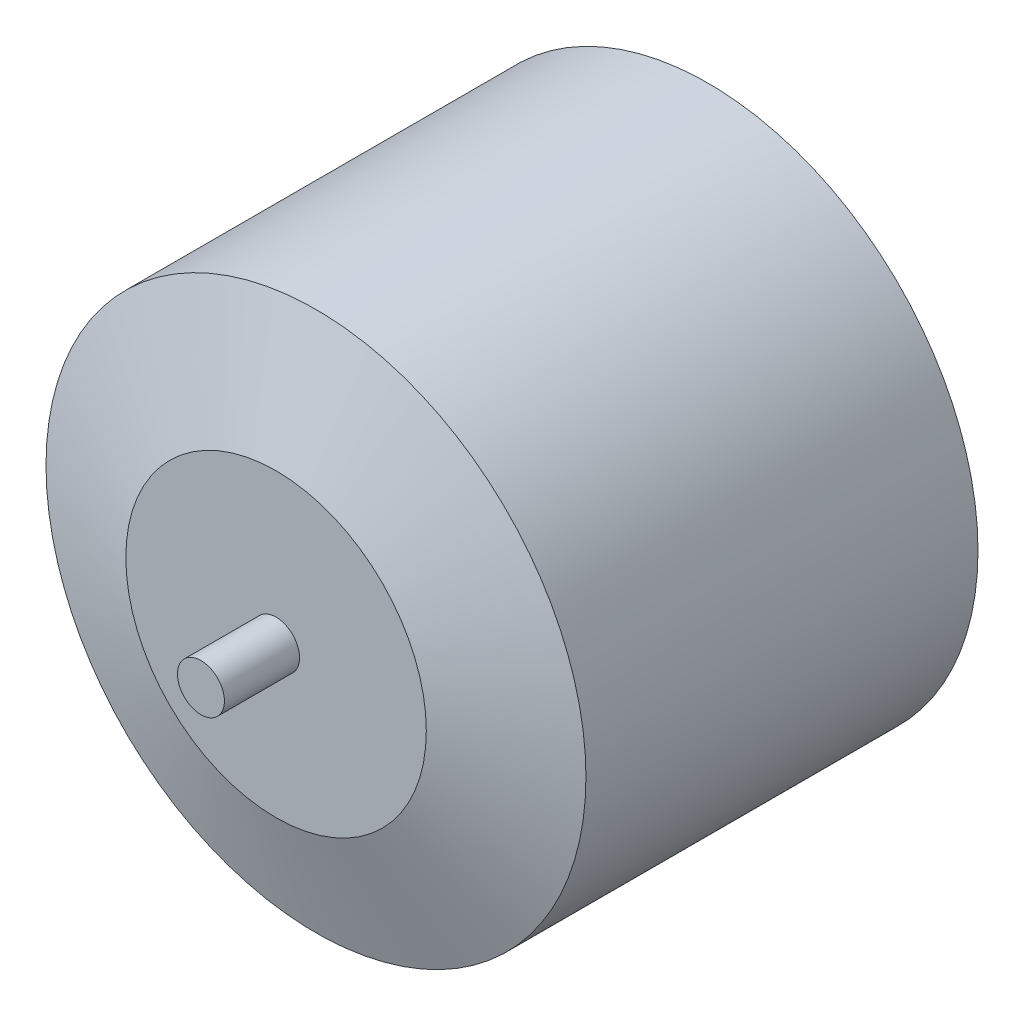
ISO-10303-21;
HEADER;
FILE_DESCRIPTION(('STEP AP214'),'2;1');
FILE_NAME('part.step','',(''),(''),'','','');
FILE_SCHEMA(('AUTOMOTIVE_DESIGN { 1 0 10303 214 1 1 1 1 }'));
ENDSEC;
DATA;
#1=APPLICATION_CONTEXT('core data for automotive mechanical design processes');
#2=APPLICATION_PROTOCOL_DEFINITION('international standard','automotive_design',2000,#1);
#3=PRODUCT_CONTEXT('',#1,'mechanical');
#4=PRODUCT('Part','Part','',(#3));
#5=PRODUCT_RELATED_PRODUCT_CATEGORY('part','',(#4));
#6=PRODUCT_DEFINITION_FORMATION('','',#4);
#7=PRODUCT_DEFINITION_CONTEXT('part definition',#1,'design');
#8=PRODUCT_DEFINITION('design','',#6,#7);
#9=PRODUCT_DEFINITION_SHAPE('','',#8);
#10=(LENGTH_UNIT() NAMED_UNIT(*) SI_UNIT(.MILLI.,.METRE.));
#11=(NAMED_UNIT(*) PLANE_ANGLE_UNIT() SI_UNIT($,.RADIAN.));
#12=(NAMED_UNIT(*) SI_UNIT($,.STERADIAN.) SOLID_ANGLE_UNIT());
#13=UNCERTAINTY_MEASURE_WITH_UNIT(LENGTH_MEASURE(1.E-05),#10,'distance_accuracy_value','');
#14=(GEOMETRIC_REPRESENTATION_CONTEXT(3) GLOBAL_UNCERTAINTY_ASSIGNED_CONTEXT((#13)) GLOBAL_UNIT_ASSIGNED_CONTEXT((#10,
#11,#12)) REPRESENTATION_CONTEXT('',''));
#15=CARTESIAN_POINT('',(0.,0.,0.));
#16=DIRECTION('',(0.,0.,1.));
#17=DIRECTION('',(1.,0.,0.));
#18=AXIS2_PLACEMENT_3D('',#15,#16,#17);
#19=CARTESIAN_POINT('',(0.,0.,-3.2));
#20=DIRECTION('',(0.,0.,1.));
#21=DIRECTION('',(1.,0.,0.));
#22=AXIS2_PLACEMENT_3D('',#19,#20,#21);
#23=CYLINDRICAL_SURFACE('',#22,1.);
#24=CARTESIAN_POINT('',(0.,0.,-3.2));
#25=DIRECTION('',(0.,0.,-1.));
#26=DIRECTION('',(-1.,0.,0.));
#27=AXIS2_PLACEMENT_3D('',#24,#25,#26);
#28=CIRCLE('',#27,1.);
#29=CARTESIAN_POINT('',(-1.,0.,-3.2));
#30=VERTEX_POINT('',#29);
#31=EDGE_CURVE('E37',#30,#30,#28,.F.);
#32=ORIENTED_EDGE('',*,*,#31,.T.);
#33=EDGE_LOOP('',(#32));
#34=FACE_BOUND('',#33,.T.);
#35=CARTESIAN_POINT('',(0.,0.,0.));
#36=DIRECTION('',(0.,0.,1.));
#37=DIRECTION('',(1.,0.,0.));
#38=AXIS2_PLACEMENT_3D('',#35,#36,#37);
#39=CIRCLE('',#38,1.);
#40=CARTESIAN_POINT('',(1.,0.,0.));
#41=VERTEX_POINT('',#40);
#42=EDGE_CURVE('E10',#41,#41,#39,.T.);
#43=ORIENTED_EDGE('',*,*,#42,.F.);
#44=EDGE_LOOP('',(#43));
#45=FACE_BOUND('',#44,.T.);
#46=ADVANCED_FACE('F31',(#34,#45),#23,.T.);
#47=CARTESIAN_POINT('',(0.,0.,0.));
#48=DIRECTION('',(0.,0.,1.));
#49=DIRECTION('',(1.,0.,0.));
#50=AXIS2_PLACEMENT_3D('',#47,#48,#49);
#51=PLANE('',#50);
#52=ORIENTED_EDGE('',*,*,#42,.T.);
#53=EDGE_LOOP('',(#52));
#54=FACE_BOUND('',#53,.T.);
#55=ADVANCED_FACE('F74',(#54),#51,.T.);
#56=CARTESIAN_POINT('',(-6.4,0.,-3.2));
#57=DIRECTION('',(0.,0.,-1.));
#58=DIRECTION('',(-1.,0.,0.));
#59=AXIS2_PLACEMENT_3D('',#56,#57,#58);
#60=PLANE('',#59);
#61=ORIENTED_EDGE('',*,*,#31,.F.);
#62=EDGE_LOOP('',(#61));
#63=FACE_BOUND('',#62,.T.);
#64=CARTESIAN_POINT('',(0.,0.,-3.2));
#65=DIRECTION('',(0.,0.,1.));
#66=DIRECTION('',(1.,0.,0.));
#67=AXIS2_PLACEMENT_3D('',#64,#65,#66);
#68=CIRCLE('',#67,6.4);
#69=CARTESIAN_POINT('',(6.4,0.,-3.2));
#70=VERTEX_POINT('',#69);
#71=EDGE_CURVE('E50',#70,#70,#68,.T.);
#72=ORIENTED_EDGE('',*,*,#71,.T.);
#73=EDGE_LOOP('',(#72));
#74=FACE_BOUND('',#73,.T.);
#75=ADVANCED_FACE('F54',(#63,#74),#60,.F.);
#76=CARTESIAN_POINT('',(0.,0.,-21.6));
#77=DIRECTION('',(0.,0.,1.));
#78=DIRECTION('',(1.,0.,0.));
#79=AXIS2_PLACEMENT_3D('',#76,#77,#78);
#80=PLANE('',#79);
#81=CARTESIAN_POINT('',(0.,0.,-21.6));
#82=DIRECTION('',(0.,0.,1.));
#83=DIRECTION('',(1.,0.,0.));
#84=AXIS2_PLACEMENT_3D('',#81,#82,#83);
#85=CIRCLE('',#84,11.5);
#86=CARTESIAN_POINT('',(11.5,0.,-21.6));
#87=VERTEX_POINT('',#86);
#88=EDGE_CURVE('E41',#87,#87,#85,.T.);
#89=ORIENTED_EDGE('',*,*,#88,.F.);
#90=EDGE_LOOP('',(#89));
#91=FACE_BOUND('',#90,.T.);
#92=ADVANCED_FACE('F65',(#91),#80,.F.);
#93=CARTESIAN_POINT('',(0.,0.,-3.2));
#94=DIRECTION('',(0.,0.,1.));
#95=DIRECTION('',(1.,0.,0.));
#96=AXIS2_PLACEMENT_3D('',#93,#94,#95);
#97=CYLINDRICAL_SURFACE('',#96,11.5);
#98=CARTESIAN_POINT('',(0.,0.,-4.9));
#99=DIRECTION('',(0.,0.,1.));
#100=DIRECTION('',(1.,0.,0.));
#101=AXIS2_PLACEMENT_3D('',#98,#99,#100);
#102=CIRCLE('',#101,11.5);
#103=CARTESIAN_POINT('',(11.5,0.,-4.9));
#104=VERTEX_POINT('',#103);
#105=EDGE_CURVE('E45',#104,#104,#102,.T.);
#106=ORIENTED_EDGE('',*,*,#105,.F.);
#107=EDGE_LOOP('',(#106));
#108=FACE_BOUND('',#107,.T.);
#109=ORIENTED_EDGE('',*,*,#88,.T.);
#110=EDGE_LOOP('',(#109));
#111=FACE_BOUND('',#110,.T.);
#112=ADVANCED_FACE('F59',(#108,#111),#97,.T.);
#113=CARTESIAN_POINT('',(0.,0.,-4.9));
#114=DIRECTION('',(0.,0.,-1.));
#115=DIRECTION('',(-1.,0.,0.));
#116=AXIS2_PLACEMENT_3D('',#113,#114,#115);
#117=CONICAL_SURFACE('',#116,11.5,1.24904577239825);
#118=ORIENTED_EDGE('',*,*,#71,.F.);
#119=EDGE_LOOP('',(#118));
#120=FACE_BOUND('',#119,.T.);
#121=ORIENTED_EDGE('',*,*,#105,.T.);
#122=EDGE_LOOP('',(#121));
#123=FACE_BOUND('',#122,.T.);
#124=ADVANCED_FACE('F56',(#120,#123),#117,.T.);
#125=CLOSED_SHELL('',(#46,#55,#75,#92,#112,#124));
#126=MANIFOLD_SOLID_BREP('B2',#125);
#127=ADVANCED_BREP_SHAPE_REPRESENTATION('',(#18,#126),#14);
#128=SHAPE_DEFINITION_REPRESENTATION(#9,#127);
ENDSEC;
END-ISO-10303-21;
